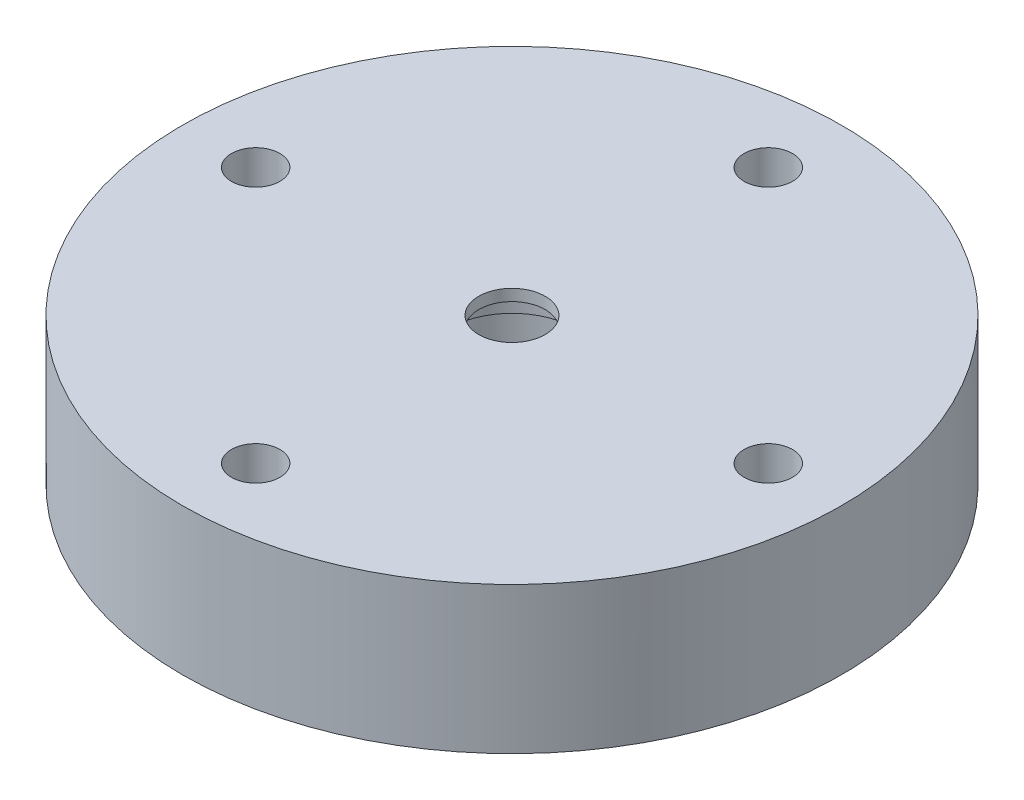
ISO-10303-21;
HEADER;
FILE_DESCRIPTION(('STEP AP214'),'2;1');
FILE_NAME('part.step','',(''),(''),'','','');
FILE_SCHEMA(('AUTOMOTIVE_DESIGN { 1 0 10303 214 1 1 1 1 }'));
ENDSEC;
DATA;
#1=APPLICATION_CONTEXT('core data for automotive mechanical design processes');
#2=APPLICATION_PROTOCOL_DEFINITION('international standard','automotive_design',2000,#1);
#3=PRODUCT_CONTEXT('',#1,'mechanical');
#4=PRODUCT('Part','Part','',(#3));
#5=PRODUCT_RELATED_PRODUCT_CATEGORY('part','',(#4));
#6=PRODUCT_DEFINITION_FORMATION('','',#4);
#7=PRODUCT_DEFINITION_CONTEXT('part definition',#1,'design');
#8=PRODUCT_DEFINITION('design','',#6,#7);
#9=PRODUCT_DEFINITION_SHAPE('','',#8);
#10=(LENGTH_UNIT() NAMED_UNIT(*) SI_UNIT(.MILLI.,.METRE.));
#11=(NAMED_UNIT(*) PLANE_ANGLE_UNIT() SI_UNIT($,.RADIAN.));
#12=(NAMED_UNIT(*) SI_UNIT($,.STERADIAN.) SOLID_ANGLE_UNIT());
#13=UNCERTAINTY_MEASURE_WITH_UNIT(LENGTH_MEASURE(1.E-05),#10,'distance_accuracy_value','');
#14=(GEOMETRIC_REPRESENTATION_CONTEXT(3) GLOBAL_UNCERTAINTY_ASSIGNED_CONTEXT((#13)) GLOBAL_UNIT_ASSIGNED_CONTEXT((#10,
#11,#12)) REPRESENTATION_CONTEXT('',''));
#15=CARTESIAN_POINT('',(0.,0.,0.));
#16=DIRECTION('',(0.,0.,1.));
#17=DIRECTION('',(1.,0.,0.));
#18=AXIS2_PLACEMENT_3D('',#15,#16,#17);
#19=CARTESIAN_POINT('',(0.,-5.5372,0.));
#20=DIRECTION('',(0.,1.,0.));
#21=DIRECTION('',(0.,0.,1.));
#22=AXIS2_PLACEMENT_3D('',#19,#20,#21);
#23=CYLINDRICAL_SURFACE('',#22,57.15);
#24=CARTESIAN_POINT('',(0.,2.,0.));
#25=DIRECTION('',(0.,1.,0.));
#26=DIRECTION('',(0.,0.,1.));
#27=AXIS2_PLACEMENT_3D('',#24,#25,#26);
#28=CIRCLE('',#27,57.15);
#29=CARTESIAN_POINT('',(0.,2.,57.15));
#30=VERTEX_POINT('',#29);
#31=EDGE_CURVE('E10',#30,#30,#28,.T.);
#32=ORIENTED_EDGE('',*,*,#31,.F.);
#33=EDGE_LOOP('',(#32));
#34=FACE_BOUND('',#33,.T.);
#35=CARTESIAN_POINT('',(0.,-23.4122,0.));
#36=DIRECTION('',(0.,-1.,0.));
#37=DIRECTION('',(0.,0.,-1.));
#38=AXIS2_PLACEMENT_3D('',#35,#36,#37);
#39=CIRCLE('',#38,57.15);
#40=CARTESIAN_POINT('',(0.,-23.4122,-57.15));
#41=VERTEX_POINT('',#40);
#42=EDGE_CURVE('E36',#41,#41,#39,.T.);
#43=ORIENTED_EDGE('',*,*,#42,.F.);
#44=EDGE_LOOP('',(#43));
#45=FACE_BOUND('',#44,.T.);
#46=ADVANCED_FACE('F30',(#34,#45),#23,.T.);
#47=CARTESIAN_POINT('',(0.,2.,0.));
#48=DIRECTION('',(0.,1.,0.));
#49=DIRECTION('',(0.,0.,1.));
#50=AXIS2_PLACEMENT_3D('',#47,#48,#49);
#51=PLANE('',#50);
#52=CARTESIAN_POINT('',(-44.45,2.,0.));
#53=DIRECTION('',(0.,1.,0.));
#54=DIRECTION('',(0.,0.,1.));
#55=AXIS2_PLACEMENT_3D('',#52,#53,#54);
#56=CIRCLE('',#55,4.2);
#57=CARTESIAN_POINT('',(-44.45,2.,4.2));
#58=VERTEX_POINT('',#57);
#59=EDGE_CURVE('E82',#58,#58,#56,.T.);
#60=ORIENTED_EDGE('',*,*,#59,.F.);
#61=EDGE_LOOP('',(#60));
#62=FACE_BOUND('',#61,.T.);
#63=CARTESIAN_POINT('',(0.,2.,-44.45));
#64=DIRECTION('',(0.,1.,0.));
#65=DIRECTION('',(0.,0.,1.));
#66=AXIS2_PLACEMENT_3D('',#63,#64,#65);
#67=CIRCLE('',#66,4.2);
#68=CARTESIAN_POINT('',(0.,2.,-40.25));
#69=VERTEX_POINT('',#68);
#70=EDGE_CURVE('E76',#69,#69,#67,.T.);
#71=ORIENTED_EDGE('',*,*,#70,.F.);
#72=EDGE_LOOP('',(#71));
#73=FACE_BOUND('',#72,.T.);
#74=CARTESIAN_POINT('',(44.45,2.,0.));
#75=DIRECTION('',(0.,1.,0.));
#76=DIRECTION('',(0.,0.,1.));
#77=AXIS2_PLACEMENT_3D('',#74,#75,#76);
#78=CIRCLE('',#77,4.2);
#79=CARTESIAN_POINT('',(44.45,2.,4.2));
#80=VERTEX_POINT('',#79);
#81=EDGE_CURVE('E70',#80,#80,#78,.T.);
#82=ORIENTED_EDGE('',*,*,#81,.F.);
#83=EDGE_LOOP('',(#82));
#84=FACE_BOUND('',#83,.T.);
#85=CARTESIAN_POINT('',(0.,2.,44.45));
#86=DIRECTION('',(0.,1.,0.));
#87=DIRECTION('',(0.,0.,1.));
#88=AXIS2_PLACEMENT_3D('',#85,#86,#87);
#89=CIRCLE('',#88,4.2);
#90=CARTESIAN_POINT('',(0.,2.,48.65));
#91=VERTEX_POINT('',#90);
#92=EDGE_CURVE('E64',#91,#91,#89,.T.);
#93=ORIENTED_EDGE('',*,*,#92,.F.);
#94=EDGE_LOOP('',(#93));
#95=FACE_BOUND('',#94,.T.);
#96=CARTESIAN_POINT('',(0.,2.,0.));
#97=DIRECTION('',(0.,1.,0.));
#98=DIRECTION('',(0.,0.,1.));
#99=AXIS2_PLACEMENT_3D('',#96,#97,#98);
#100=CIRCLE('',#99,5.7625);
#101=CARTESIAN_POINT('',(0.,2.,5.7625));
#102=VERTEX_POINT('',#101);
#103=EDGE_CURVE('E55',#102,#102,#100,.T.);
#104=ORIENTED_EDGE('',*,*,#103,.F.);
#105=EDGE_LOOP('',(#104));
#106=FACE_BOUND('',#105,.T.);
#107=ORIENTED_EDGE('',*,*,#31,.T.);
#108=EDGE_LOOP('',(#107));
#109=FACE_BOUND('',#108,.T.);
#110=ADVANCED_FACE('F88',(#62,#73,#84,#95,#106,#109),#51,.T.);
#111=CARTESIAN_POINT('',(0.,-23.4122,0.));
#112=DIRECTION('',(0.,-1.,0.));
#113=DIRECTION('',(0.,0.,-1.));
#114=AXIS2_PLACEMENT_3D('',#111,#112,#113);
#115=PLANE('',#114);
#116=CARTESIAN_POINT('',(-44.45,-23.4122,0.));
#117=DIRECTION('',(0.,1.,0.));
#118=DIRECTION('',(0.,0.,1.));
#119=AXIS2_PLACEMENT_3D('',#116,#117,#118);
#120=CIRCLE('',#119,4.2);
#121=CARTESIAN_POINT('',(-44.45,-23.4122,4.2));
#122=VERTEX_POINT('',#121);
#123=EDGE_CURVE('E79',#122,#122,#120,.T.);
#124=ORIENTED_EDGE('',*,*,#123,.T.);
#125=EDGE_LOOP('',(#124));
#126=FACE_BOUND('',#125,.T.);
#127=CARTESIAN_POINT('',(0.,-23.4122,-44.45));
#128=DIRECTION('',(0.,1.,0.));
#129=DIRECTION('',(0.,0.,1.));
#130=AXIS2_PLACEMENT_3D('',#127,#128,#129);
#131=CIRCLE('',#130,4.19999999999999);
#132=CARTESIAN_POINT('',(0.,-23.4122,-40.25));
#133=VERTEX_POINT('',#132);
#134=EDGE_CURVE('E73',#133,#133,#131,.T.);
#135=ORIENTED_EDGE('',*,*,#134,.T.);
#136=EDGE_LOOP('',(#135));
#137=FACE_BOUND('',#136,.T.);
#138=CARTESIAN_POINT('',(44.45,-23.4122,0.));
#139=DIRECTION('',(0.,1.,0.));
#140=DIRECTION('',(0.,0.,1.));
#141=AXIS2_PLACEMENT_3D('',#138,#139,#140);
#142=CIRCLE('',#141,4.2);
#143=CARTESIAN_POINT('',(44.45,-23.4122,4.2));
#144=VERTEX_POINT('',#143);
#145=EDGE_CURVE('E67',#144,#144,#142,.T.);
#146=ORIENTED_EDGE('',*,*,#145,.T.);
#147=EDGE_LOOP('',(#146));
#148=FACE_BOUND('',#147,.T.);
#149=CARTESIAN_POINT('',(0.,-23.4122,44.45));
#150=DIRECTION('',(0.,1.,0.));
#151=DIRECTION('',(0.,0.,1.));
#152=AXIS2_PLACEMENT_3D('',#149,#150,#151);
#153=CIRCLE('',#152,4.19999999999999);
#154=CARTESIAN_POINT('',(0.,-23.4122,48.65));
#155=VERTEX_POINT('',#154);
#156=EDGE_CURVE('E61',#155,#155,#153,.T.);
#157=ORIENTED_EDGE('',*,*,#156,.T.);
#158=EDGE_LOOP('',(#157));
#159=FACE_BOUND('',#158,.T.);
#160=CARTESIAN_POINT('',(0.,-23.4122,0.));
#161=DIRECTION('',(0.,-1.,0.));
#162=DIRECTION('',(0.,0.,-1.));
#163=AXIS2_PLACEMENT_3D('',#160,#161,#162);
#164=CIRCLE('',#163,12.7);
#165=CARTESIAN_POINT('',(0.,-23.4122,-12.7));
#166=VERTEX_POINT('',#165);
#167=EDGE_CURVE('E49',#166,#166,#164,.T.);
#168=ORIENTED_EDGE('',*,*,#167,.F.);
#169=EDGE_LOOP('',(#168));
#170=FACE_BOUND('',#169,.T.);
#171=ORIENTED_EDGE('',*,*,#42,.T.);
#172=EDGE_LOOP('',(#171));
#173=FACE_BOUND('',#172,.T.);
#174=ADVANCED_FACE('F91',(#126,#137,#148,#159,#170,#173),#115,.T.);
#175=CARTESIAN_POINT('',(0.,-5.5372,0.));
#176=DIRECTION('',(0.,-1.,0.));
#177=DIRECTION('',(0.,0.,-1.));
#178=AXIS2_PLACEMENT_3D('',#175,#176,#177);
#179=PLANE('',#178);
#180=CARTESIAN_POINT('',(0.,-5.5372,0.));
#181=DIRECTION('',(0.,-1.,0.));
#182=DIRECTION('',(0.,0.,-1.));
#183=AXIS2_PLACEMENT_3D('',#180,#181,#182);
#184=CIRCLE('',#183,12.7);
#185=CARTESIAN_POINT('',(0.,-5.5372,-12.7));
#186=VERTEX_POINT('',#185);
#187=EDGE_CURVE('E52',#186,#186,#184,.T.);
#188=ORIENTED_EDGE('',*,*,#187,.T.);
#189=EDGE_LOOP('',(#188));
#190=FACE_BOUND('',#189,.T.);
#191=CARTESIAN_POINT('',(0.,-5.5372,0.));
#192=DIRECTION('',(0.,-1.,0.));
#193=DIRECTION('',(0.,0.,-1.));
#194=AXIS2_PLACEMENT_3D('',#191,#192,#193);
#195=CIRCLE('',#194,11.1125);
#196=CARTESIAN_POINT('',(0.,-5.5372,-11.1125));
#197=VERTEX_POINT('',#196);
#198=EDGE_CURVE('E44',#197,#197,#195,.F.);
#199=ORIENTED_EDGE('',*,*,#198,.T.);
#200=EDGE_LOOP('',(#199));
#201=FACE_BOUND('',#200,.T.);
#202=ADVANCED_FACE('F134',(#190,#201),#179,.T.);
#203=CARTESIAN_POINT('',(0.,-59.3332244842766,0.));
#204=DIRECTION('',(0.,1.,0.));
#205=DIRECTION('',(0.,0.,1.));
#206=AXIS2_PLACEMENT_3D('',#203,#204,#205);
#207=CYLINDRICAL_SURFACE('',#206,12.7);
#208=ORIENTED_EDGE('',*,*,#167,.T.);
#209=EDGE_LOOP('',(#208));
#210=FACE_BOUND('',#209,.T.);
#211=ORIENTED_EDGE('',*,*,#187,.F.);
#212=EDGE_LOOP('',(#211));
#213=FACE_BOUND('',#212,.T.);
#214=ADVANCED_FACE('F143',(#210,#213),#207,.F.);
#215=CARTESIAN_POINT('',(0.,-5.5372,0.));
#216=DIRECTION('',(0.,1.,0.));
#217=DIRECTION('',(0.,0.,1.));
#218=AXIS2_PLACEMENT_3D('',#215,#216,#217);
#219=CYLINDRICAL_SURFACE('',#218,11.1125);
#220=ORIENTED_EDGE('',*,*,#198,.F.);
#221=EDGE_LOOP('',(#220));
#222=FACE_BOUND('',#221,.T.);
#223=CARTESIAN_POINT('',(0.,0.,0.));
#224=DIRECTION('',(0.,1.,0.));
#225=DIRECTION('',(0.,0.,1.));
#226=AXIS2_PLACEMENT_3D('',#223,#224,#225);
#227=CIRCLE('',#226,11.1125);
#228=CARTESIAN_POINT('',(0.,0.,11.1125));
#229=VERTEX_POINT('',#228);
#230=EDGE_CURVE('E40',#229,#229,#227,.T.);
#231=ORIENTED_EDGE('',*,*,#230,.T.);
#232=EDGE_LOOP('',(#231));
#233=FACE_BOUND('',#232,.T.);
#234=ADVANCED_FACE('F113',(#222,#233),#219,.F.);
#235=CARTESIAN_POINT('',(0.,0.,0.));
#236=DIRECTION('',(0.,1.,0.));
#237=DIRECTION('',(0.,0.,1.));
#238=AXIS2_PLACEMENT_3D('',#235,#236,#237);
#239=PLANE('',#238);
#240=CARTESIAN_POINT('',(0.,0.,0.));
#241=DIRECTION('',(0.,1.,0.));
#242=DIRECTION('',(0.,0.,1.));
#243=AXIS2_PLACEMENT_3D('',#240,#241,#242);
#244=CIRCLE('',#243,5.7625);
#245=CARTESIAN_POINT('',(0.,0.,5.7625));
#246=VERTEX_POINT('',#245);
#247=EDGE_CURVE('E58',#246,#246,#244,.T.);
#248=ORIENTED_EDGE('',*,*,#247,.T.);
#249=EDGE_LOOP('',(#248));
#250=FACE_BOUND('',#249,.T.);
#251=ORIENTED_EDGE('',*,*,#230,.F.);
#252=EDGE_LOOP('',(#251));
#253=FACE_BOUND('',#252,.T.);
#254=ADVANCED_FACE('F103',(#250,#253),#239,.F.);
#255=CARTESIAN_POINT('',(0.,18.2988113063499,0.));
#256=DIRECTION('',(0.,-1.,0.));
#257=DIRECTION('',(0.,0.,-1.));
#258=AXIS2_PLACEMENT_3D('',#255,#256,#257);
#259=CYLINDRICAL_SURFACE('',#258,5.7625);
#260=ORIENTED_EDGE('',*,*,#247,.F.);
#261=EDGE_LOOP('',(#260));
#262=FACE_BOUND('',#261,.T.);
#263=ORIENTED_EDGE('',*,*,#103,.T.);
#264=EDGE_LOOP('',(#263));
#265=FACE_BOUND('',#264,.T.);
#266=ADVANCED_FACE('F100',(#262,#265),#259,.F.);
#267=CARTESIAN_POINT('',(0.,2.,44.45));
#268=DIRECTION('',(0.,1.,0.));
#269=DIRECTION('',(0.,0.,1.));
#270=AXIS2_PLACEMENT_3D('',#267,#268,#269);
#271=CYLINDRICAL_SURFACE('',#270,4.2);
#272=ORIENTED_EDGE('',*,*,#156,.F.);
#273=EDGE_LOOP('',(#272));
#274=FACE_BOUND('',#273,.T.);
#275=ORIENTED_EDGE('',*,*,#92,.T.);
#276=EDGE_LOOP('',(#275));
#277=FACE_BOUND('',#276,.T.);
#278=ADVANCED_FACE('F102',(#274,#277),#271,.F.);
#279=CARTESIAN_POINT('',(44.45,2.,0.));
#280=DIRECTION('',(0.,1.,0.));
#281=DIRECTION('',(0.,0.,1.));
#282=AXIS2_PLACEMENT_3D('',#279,#280,#281);
#283=CYLINDRICAL_SURFACE('',#282,4.2);
#284=ORIENTED_EDGE('',*,*,#145,.F.);
#285=EDGE_LOOP('',(#284));
#286=FACE_BOUND('',#285,.T.);
#287=ORIENTED_EDGE('',*,*,#81,.T.);
#288=EDGE_LOOP('',(#287));
#289=FACE_BOUND('',#288,.T.);
#290=ADVANCED_FACE('F110',(#286,#289),#283,.F.);
#291=CARTESIAN_POINT('',(0.,2.,-44.45));
#292=DIRECTION('',(0.,1.,0.));
#293=DIRECTION('',(0.,0.,1.));
#294=AXIS2_PLACEMENT_3D('',#291,#292,#293);
#295=CYLINDRICAL_SURFACE('',#294,4.2);
#296=ORIENTED_EDGE('',*,*,#134,.F.);
#297=EDGE_LOOP('',(#296));
#298=FACE_BOUND('',#297,.T.);
#299=ORIENTED_EDGE('',*,*,#70,.T.);
#300=EDGE_LOOP('',(#299));
#301=FACE_BOUND('',#300,.T.);
#302=ADVANCED_FACE('F181',(#298,#301),#295,.F.);
#303=CARTESIAN_POINT('',(-44.45,2.,0.));
#304=DIRECTION('',(0.,1.,0.));
#305=DIRECTION('',(0.,0.,1.));
#306=AXIS2_PLACEMENT_3D('',#303,#304,#305);
#307=CYLINDRICAL_SURFACE('',#306,4.2);
#308=ORIENTED_EDGE('',*,*,#123,.F.);
#309=EDGE_LOOP('',(#308));
#310=FACE_BOUND('',#309,.T.);
#311=ORIENTED_EDGE('',*,*,#59,.T.);
#312=EDGE_LOOP('',(#311));
#313=FACE_BOUND('',#312,.T.);
#314=ADVANCED_FACE('F86',(#310,#313),#307,.F.);
#315=CLOSED_SHELL('',(#46,#110,#174,#202,#214,#234,#254,#266,#278,#290,#302,#314));
#316=MANIFOLD_SOLID_BREP('B2',#315);
#317=ADVANCED_BREP_SHAPE_REPRESENTATION('',(#18,#316),#14);
#318=SHAPE_DEFINITION_REPRESENTATION(#9,#317);
ENDSEC;
END-ISO-10303-21;
